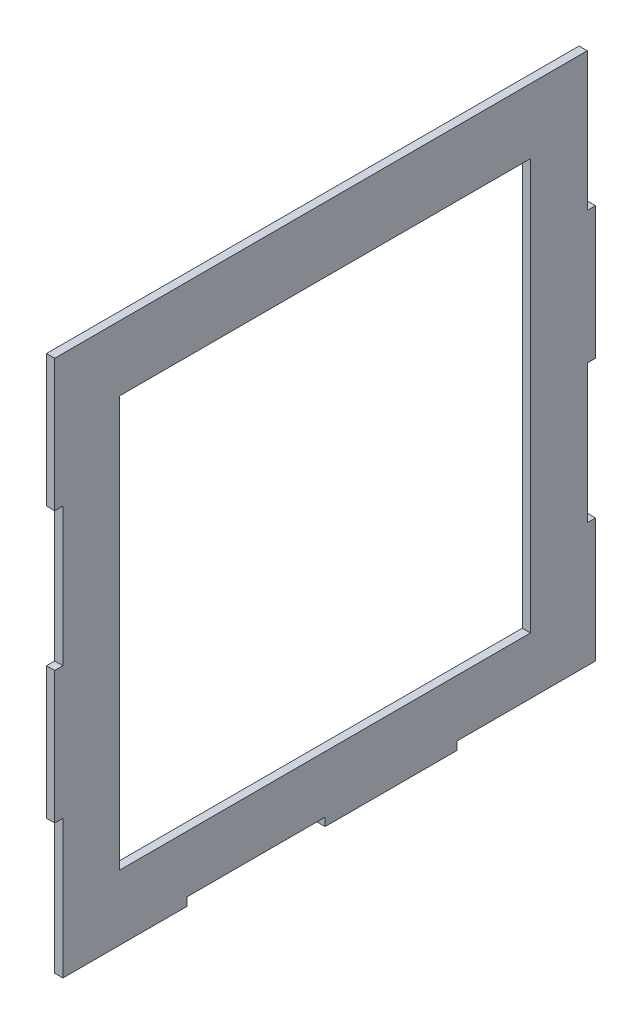
ISO-10303-21;
HEADER;
FILE_DESCRIPTION(('STEP AP214'),'2;1');
FILE_NAME('part.step','',(''),(''),'','','');
FILE_SCHEMA(('AUTOMOTIVE_DESIGN { 1 0 10303 214 1 1 1 1 }'));
ENDSEC;
DATA;
#1=APPLICATION_CONTEXT('core data for automotive mechanical design processes');
#2=APPLICATION_PROTOCOL_DEFINITION('international standard','automotive_design',2000,#1);
#3=PRODUCT_CONTEXT('',#1,'mechanical');
#4=PRODUCT('Part','Part','',(#3));
#5=PRODUCT_RELATED_PRODUCT_CATEGORY('part','',(#4));
#6=PRODUCT_DEFINITION_FORMATION('','',#4);
#7=PRODUCT_DEFINITION_CONTEXT('part definition',#1,'design');
#8=PRODUCT_DEFINITION('design','',#6,#7);
#9=PRODUCT_DEFINITION_SHAPE('','',#8);
#10=(LENGTH_UNIT() NAMED_UNIT(*) SI_UNIT(.MILLI.,.METRE.));
#11=(NAMED_UNIT(*) PLANE_ANGLE_UNIT() SI_UNIT($,.RADIAN.));
#12=(NAMED_UNIT(*) SI_UNIT($,.STERADIAN.) SOLID_ANGLE_UNIT());
#13=UNCERTAINTY_MEASURE_WITH_UNIT(LENGTH_MEASURE(1.E-05),#10,'distance_accuracy_value','');
#14=(GEOMETRIC_REPRESENTATION_CONTEXT(3) GLOBAL_UNCERTAINTY_ASSIGNED_CONTEXT((#13)) GLOBAL_UNIT_ASSIGNED_CONTEXT((#10,
#11,#12)) REPRESENTATION_CONTEXT('',''));
#15=CARTESIAN_POINT('',(0.,0.,0.));
#16=DIRECTION('',(0.,0.,1.));
#17=DIRECTION('',(1.,0.,0.));
#18=AXIS2_PLACEMENT_3D('',#15,#16,#17);
#19=CARTESIAN_POINT('',(6.,0.,-149.999999999999));
#20=DIRECTION('',(0.,0.,1.));
#21=DIRECTION('',(1.,0.,0.));
#22=AXIS2_PLACEMENT_3D('',#19,#20,#21);
#23=PLANE('',#22);
#24=DIRECTION('',(0.,1.,0.));
#25=VECTOR('',#24,1.);
#26=CARTESIAN_POINT('',(0.,0.,-149.999999999999));
#27=LINE('',#26,#25);
#28=CARTESIAN_POINT('',(0.,-150.,-149.999999999999));
#29=VERTEX_POINT('',#28);
#30=CARTESIAN_POINT('',(0.,150.,-149.999999999999));
#31=VERTEX_POINT('',#30);
#32=EDGE_CURVE('E307',#29,#31,#27,.T.);
#33=ORIENTED_EDGE('',*,*,#32,.F.);
#34=DIRECTION('',(-1.,0.,0.));
#35=VECTOR('',#34,1.);
#36=CARTESIAN_POINT('',(6.,-150.,-149.999999999999));
#37=LINE('',#36,#35);
#38=CARTESIAN_POINT('',(6.,-150.,-149.999999999999));
#39=VERTEX_POINT('',#38);
#40=EDGE_CURVE('E11',#39,#29,#37,.T.);
#41=ORIENTED_EDGE('',*,*,#40,.F.);
#42=DIRECTION('',(0.,1.,0.));
#43=VECTOR('',#42,1.);
#44=CARTESIAN_POINT('',(6.,0.,-149.999999999999));
#45=LINE('',#44,#43);
#46=CARTESIAN_POINT('',(6.,150.,-149.999999999999));
#47=VERTEX_POINT('',#46);
#48=EDGE_CURVE('E241',#39,#47,#45,.T.);
#49=ORIENTED_EDGE('',*,*,#48,.T.);
#50=DIRECTION('',(-1.,0.,0.));
#51=VECTOR('',#50,1.);
#52=CARTESIAN_POINT('',(6.,150.,-149.999999999999));
#53=LINE('',#52,#51);
#54=EDGE_CURVE('E149',#47,#31,#53,.T.);
#55=ORIENTED_EDGE('',*,*,#54,.T.);
#56=EDGE_LOOP('',(#33,#41,#49,#55));
#57=FACE_BOUND('',#56,.T.);
#58=ADVANCED_FACE('F41',(#57),#23,.T.);
#59=CARTESIAN_POINT('',(6.,-150.,0.));
#60=DIRECTION('',(0.,1.,0.));
#61=DIRECTION('',(0.,0.,1.));
#62=AXIS2_PLACEMENT_3D('',#59,#60,#61);
#63=PLANE('',#62);
#64=DIRECTION('',(0.,0.,-1.));
#65=VECTOR('',#64,1.);
#66=CARTESIAN_POINT('',(0.,-150.,0.));
#67=LINE('',#66,#65);
#68=CARTESIAN_POINT('',(0.,-150.,150.));
#69=VERTEX_POINT('',#68);
#70=EDGE_CURVE('E231',#69,#29,#67,.T.);
#71=ORIENTED_EDGE('',*,*,#70,.F.);
#72=DIRECTION('',(-1.,0.,0.));
#73=VECTOR('',#72,1.);
#74=CARTESIAN_POINT('',(6.,-150.,150.));
#75=LINE('',#74,#73);
#76=CARTESIAN_POINT('',(6.,-150.,150.));
#77=VERTEX_POINT('',#76);
#78=EDGE_CURVE('E51',#77,#69,#75,.T.);
#79=ORIENTED_EDGE('',*,*,#78,.F.);
#80=DIRECTION('',(0.,0.,-1.));
#81=VECTOR('',#80,1.);
#82=CARTESIAN_POINT('',(6.,-150.,0.));
#83=LINE('',#82,#81);
#84=EDGE_CURVE('E229',#77,#39,#83,.T.);
#85=ORIENTED_EDGE('',*,*,#84,.T.);
#86=ORIENTED_EDGE('',*,*,#40,.T.);
#87=EDGE_LOOP('',(#71,#79,#85,#86));
#88=FACE_BOUND('',#87,.T.);
#89=ADVANCED_FACE('F227',(#88),#63,.T.);
#90=CARTESIAN_POINT('',(6.,0.,150.));
#91=DIRECTION('',(0.,0.,1.));
#92=DIRECTION('',(1.,0.,0.));
#93=AXIS2_PLACEMENT_3D('',#90,#91,#92);
#94=PLANE('',#93);
#95=DIRECTION('',(0.,1.,0.));
#96=VECTOR('',#95,1.);
#97=CARTESIAN_POINT('',(0.,0.,150.));
#98=LINE('',#97,#96);
#99=CARTESIAN_POINT('',(0.,150.,150.));
#100=VERTEX_POINT('',#99);
#101=EDGE_CURVE('E310',#69,#100,#98,.T.);
#102=ORIENTED_EDGE('',*,*,#101,.T.);
#103=DIRECTION('',(-1.,0.,0.));
#104=VECTOR('',#103,1.);
#105=CARTESIAN_POINT('',(6.,150.,150.));
#106=LINE('',#105,#104);
#107=CARTESIAN_POINT('',(6.,150.,150.));
#108=VERTEX_POINT('',#107);
#109=EDGE_CURVE('E234',#108,#100,#106,.T.);
#110=ORIENTED_EDGE('',*,*,#109,.F.);
#111=DIRECTION('',(0.,1.,0.));
#112=VECTOR('',#111,1.);
#113=CARTESIAN_POINT('',(6.,0.,150.));
#114=LINE('',#113,#112);
#115=EDGE_CURVE('E237',#77,#108,#114,.T.);
#116=ORIENTED_EDGE('',*,*,#115,.F.);
#117=ORIENTED_EDGE('',*,*,#78,.T.);
#118=EDGE_LOOP('',(#102,#110,#116,#117));
#119=FACE_BOUND('',#118,.T.);
#120=ADVANCED_FACE('F238',(#119),#94,.F.);
#121=CARTESIAN_POINT('',(6.,0.,-191.5));
#122=DIRECTION('',(0.,0.,-1.));
#123=DIRECTION('',(0.,1.,0.));
#124=AXIS2_PLACEMENT_3D('',#121,#122,#123);
#125=PLANE('',#124);
#126=DIRECTION('',(0.,-1.,0.));
#127=VECTOR('',#126,1.);
#128=CARTESIAN_POINT('',(0.,0.,-191.5));
#129=LINE('',#128,#127);
#130=CARTESIAN_POINT('',(0.,0.,-191.5));
#131=VERTEX_POINT('',#130);
#132=CARTESIAN_POINT('',(0.,-101.,-191.5));
#133=VERTEX_POINT('',#132);
#134=EDGE_CURVE('E249',#131,#133,#129,.T.);
#135=ORIENTED_EDGE('',*,*,#134,.F.);
#136=DIRECTION('',(-1.,0.,0.));
#137=VECTOR('',#136,1.);
#138=CARTESIAN_POINT('',(6.,0.,-191.5));
#139=LINE('',#138,#137);
#140=CARTESIAN_POINT('',(6.,0.,-191.5));
#141=VERTEX_POINT('',#140);
#142=EDGE_CURVE('E45',#141,#131,#139,.T.);
#143=ORIENTED_EDGE('',*,*,#142,.F.);
#144=DIRECTION('',(0.,-1.,0.));
#145=VECTOR('',#144,1.);
#146=CARTESIAN_POINT('',(6.,0.,-191.5));
#147=LINE('',#146,#145);
#148=CARTESIAN_POINT('',(6.,-101.,-191.5));
#149=VERTEX_POINT('',#148);
#150=EDGE_CURVE('E313',#141,#149,#147,.T.);
#151=ORIENTED_EDGE('',*,*,#150,.T.);
#152=DIRECTION('',(-1.,0.,0.));
#153=VECTOR('',#152,1.);
#154=CARTESIAN_POINT('',(6.,-101.,-191.5));
#155=LINE('',#154,#153);
#156=EDGE_CURVE('E248',#149,#133,#155,.T.);
#157=ORIENTED_EDGE('',*,*,#156,.T.);
#158=EDGE_LOOP('',(#135,#143,#151,#157));
#159=FACE_BOUND('',#158,.T.);
#160=ADVANCED_FACE('F43',(#159),#125,.T.);
#161=CARTESIAN_POINT('',(6.,0.,0.));
#162=DIRECTION('',(0.,-1.,0.));
#163=DIRECTION('',(0.,0.,-1.));
#164=AXIS2_PLACEMENT_3D('',#161,#162,#163);
#165=PLANE('',#164);
#166=DIRECTION('',(0.,0.,1.));
#167=VECTOR('',#166,1.);
#168=CARTESIAN_POINT('',(0.,0.,0.));
#169=LINE('',#168,#167);
#170=CARTESIAN_POINT('',(0.,0.,-197.5));
#171=VERTEX_POINT('',#170);
#172=EDGE_CURVE('E252',#171,#131,#169,.T.);
#173=ORIENTED_EDGE('',*,*,#172,.F.);
#174=DIRECTION('',(-1.,0.,0.));
#175=VECTOR('',#174,1.);
#176=CARTESIAN_POINT('',(6.,0.,-197.5));
#177=LINE('',#176,#175);
#178=CARTESIAN_POINT('',(6.,0.,-197.5));
#179=VERTEX_POINT('',#178);
#180=EDGE_CURVE('E358',#179,#171,#177,.T.);
#181=ORIENTED_EDGE('',*,*,#180,.F.);
#182=DIRECTION('',(0.,0.,1.));
#183=VECTOR('',#182,1.);
#184=CARTESIAN_POINT('',(6.,0.,0.));
#185=LINE('',#184,#183);
#186=EDGE_CURVE('E367',#179,#141,#185,.T.);
#187=ORIENTED_EDGE('',*,*,#186,.T.);
#188=ORIENTED_EDGE('',*,*,#142,.T.);
#189=EDGE_LOOP('',(#173,#181,#187,#188));
#190=FACE_BOUND('',#189,.T.);
#191=ADVANCED_FACE('F365',(#190),#165,.T.);
#192=CARTESIAN_POINT('',(6.,0.,-197.5));
#193=DIRECTION('',(0.,0.,1.));
#194=DIRECTION('',(1.,0.,0.));
#195=AXIS2_PLACEMENT_3D('',#192,#193,#194);
#196=PLANE('',#195);
#197=DIRECTION('',(0.,1.,0.));
#198=VECTOR('',#197,1.);
#199=CARTESIAN_POINT('',(0.,0.,-197.5));
#200=LINE('',#199,#198);
#201=CARTESIAN_POINT('',(0.,96.5,-197.5));
#202=VERTEX_POINT('',#201);
#203=EDGE_CURVE('E255',#171,#202,#200,.T.);
#204=ORIENTED_EDGE('',*,*,#203,.T.);
#205=DIRECTION('',(-1.,0.,0.));
#206=VECTOR('',#205,1.);
#207=CARTESIAN_POINT('',(6.,96.5,-197.5));
#208=LINE('',#207,#206);
#209=CARTESIAN_POINT('',(6.,96.5,-197.5));
#210=VERTEX_POINT('',#209);
#211=EDGE_CURVE('E356',#210,#202,#208,.T.);
#212=ORIENTED_EDGE('',*,*,#211,.F.);
#213=DIRECTION('',(0.,1.,0.));
#214=VECTOR('',#213,1.);
#215=CARTESIAN_POINT('',(6.,0.,-197.5));
#216=LINE('',#215,#214);
#217=EDGE_CURVE('E384',#179,#210,#216,.T.);
#218=ORIENTED_EDGE('',*,*,#217,.F.);
#219=ORIENTED_EDGE('',*,*,#180,.T.);
#220=EDGE_LOOP('',(#204,#212,#218,#219));
#221=FACE_BOUND('',#220,.T.);
#222=ADVANCED_FACE('F374',(#221),#196,.F.);
#223=CARTESIAN_POINT('',(6.,96.5000000000005,-2.2320108724235E-13));
#224=DIRECTION('',(0.,-1.,0.));
#225=DIRECTION('',(0.,0.,-1.));
#226=AXIS2_PLACEMENT_3D('',#223,#224,#225);
#227=PLANE('',#226);
#228=DIRECTION('',(0.,0.,1.));
#229=VECTOR('',#228,1.);
#230=CARTESIAN_POINT('',(0.,96.5000000000005,-2.2320108724235E-13));
#231=LINE('',#230,#229);
#232=CARTESIAN_POINT('',(0.,96.5,-191.5));
#233=VERTEX_POINT('',#232);
#234=EDGE_CURVE('E257',#202,#233,#231,.T.);
#235=ORIENTED_EDGE('',*,*,#234,.T.);
#236=DIRECTION('',(-1.,0.,0.));
#237=VECTOR('',#236,1.);
#238=CARTESIAN_POINT('',(6.,96.5,-191.5));
#239=LINE('',#238,#237);
#240=CARTESIAN_POINT('',(6.,96.5,-191.5));
#241=VERTEX_POINT('',#240);
#242=EDGE_CURVE('E354',#241,#233,#239,.T.);
#243=ORIENTED_EDGE('',*,*,#242,.F.);
#244=DIRECTION('',(0.,0.,1.));
#245=VECTOR('',#244,1.);
#246=CARTESIAN_POINT('',(6.,96.5000000000005,-2.2320108724235E-13));
#247=LINE('',#246,#245);
#248=EDGE_CURVE('E379',#210,#241,#247,.T.);
#249=ORIENTED_EDGE('',*,*,#248,.F.);
#250=ORIENTED_EDGE('',*,*,#211,.T.);
#251=EDGE_LOOP('',(#235,#243,#249,#250));
#252=FACE_BOUND('',#251,.T.);
#253=ADVANCED_FACE('F377',(#252),#227,.F.);
#254=CARTESIAN_POINT('',(6.,0.,-191.5));
#255=DIRECTION('',(0.,0.,-1.));
#256=DIRECTION('',(0.,1.,0.));
#257=AXIS2_PLACEMENT_3D('',#254,#255,#256);
#258=PLANE('',#257);
#259=DIRECTION('',(0.,-1.,0.));
#260=VECTOR('',#259,1.);
#261=CARTESIAN_POINT('',(0.,0.,-191.5));
#262=LINE('',#261,#260);
#263=CARTESIAN_POINT('',(0.,197.5,-191.5));
#264=VERTEX_POINT('',#263);
#265=EDGE_CURVE('E261',#264,#233,#262,.T.);
#266=ORIENTED_EDGE('',*,*,#265,.F.);
#267=DIRECTION('',(-1.,0.,0.));
#268=VECTOR('',#267,1.);
#269=CARTESIAN_POINT('',(6.,197.5,-191.5));
#270=LINE('',#269,#268);
#271=CARTESIAN_POINT('',(6.,197.5,-191.5));
#272=VERTEX_POINT('',#271);
#273=EDGE_CURVE('E352',#272,#264,#270,.T.);
#274=ORIENTED_EDGE('',*,*,#273,.F.);
#275=DIRECTION('',(0.,-1.,0.));
#276=VECTOR('',#275,1.);
#277=CARTESIAN_POINT('',(6.,0.,-191.5));
#278=LINE('',#277,#276);
#279=EDGE_CURVE('E383',#272,#241,#278,.T.);
#280=ORIENTED_EDGE('',*,*,#279,.T.);
#281=ORIENTED_EDGE('',*,*,#242,.T.);
#282=EDGE_LOOP('',(#266,#274,#280,#281));
#283=FACE_BOUND('',#282,.T.);
#284=ADVANCED_FACE('F503',(#283),#258,.T.);
#285=CARTESIAN_POINT('',(6.,197.5,0.));
#286=DIRECTION('',(0.,1.,0.));
#287=DIRECTION('',(0.,0.,1.));
#288=AXIS2_PLACEMENT_3D('',#285,#286,#287);
#289=PLANE('',#288);
#290=DIRECTION('',(0.,0.,-1.));
#291=VECTOR('',#290,1.);
#292=CARTESIAN_POINT('',(0.,197.5,0.));
#293=LINE('',#292,#291);
#294=CARTESIAN_POINT('',(0.,197.5,197.5));
#295=VERTEX_POINT('',#294);
#296=EDGE_CURVE('E264',#295,#264,#293,.T.);
#297=ORIENTED_EDGE('',*,*,#296,.F.);
#298=DIRECTION('',(-1.,0.,0.));
#299=VECTOR('',#298,1.);
#300=CARTESIAN_POINT('',(6.,197.5,197.5));
#301=LINE('',#300,#299);
#302=CARTESIAN_POINT('',(6.,197.5,197.5));
#303=VERTEX_POINT('',#302);
#304=EDGE_CURVE('E350',#303,#295,#301,.T.);
#305=ORIENTED_EDGE('',*,*,#304,.F.);
#306=DIRECTION('',(0.,0.,-1.));
#307=VECTOR('',#306,1.);
#308=CARTESIAN_POINT('',(6.,197.5,0.));
#309=LINE('',#308,#307);
#310=EDGE_CURVE('E386',#303,#272,#309,.T.);
#311=ORIENTED_EDGE('',*,*,#310,.T.);
#312=ORIENTED_EDGE('',*,*,#273,.T.);
#313=EDGE_LOOP('',(#297,#305,#311,#312));
#314=FACE_BOUND('',#313,.T.);
#315=ADVANCED_FACE('F500',(#314),#289,.T.);
#316=CARTESIAN_POINT('',(6.,0.,197.5));
#317=DIRECTION('',(0.,0.,1.));
#318=DIRECTION('',(1.,0.,0.));
#319=AXIS2_PLACEMENT_3D('',#316,#317,#318);
#320=PLANE('',#319);
#321=DIRECTION('',(0.,1.,0.));
#322=VECTOR('',#321,1.);
#323=CARTESIAN_POINT('',(0.,0.,197.5));
#324=LINE('',#323,#322);
#325=CARTESIAN_POINT('',(0.,101.,197.5));
#326=VERTEX_POINT('',#325);
#327=EDGE_CURVE('E267',#326,#295,#324,.T.);
#328=ORIENTED_EDGE('',*,*,#327,.F.);
#329=DIRECTION('',(-1.,0.,0.));
#330=VECTOR('',#329,1.);
#331=CARTESIAN_POINT('',(6.,101.,197.5));
#332=LINE('',#331,#330);
#333=CARTESIAN_POINT('',(6.,101.,197.5));
#334=VERTEX_POINT('',#333);
#335=EDGE_CURVE('E348',#334,#326,#332,.T.);
#336=ORIENTED_EDGE('',*,*,#335,.F.);
#337=DIRECTION('',(0.,1.,0.));
#338=VECTOR('',#337,1.);
#339=CARTESIAN_POINT('',(6.,0.,197.5));
#340=LINE('',#339,#338);
#341=EDGE_CURVE('E394',#334,#303,#340,.T.);
#342=ORIENTED_EDGE('',*,*,#341,.T.);
#343=ORIENTED_EDGE('',*,*,#304,.T.);
#344=EDGE_LOOP('',(#328,#336,#342,#343));
#345=FACE_BOUND('',#344,.T.);
#346=ADVANCED_FACE('F496',(#345),#320,.T.);
#347=CARTESIAN_POINT('',(6.,101.,0.));
#348=DIRECTION('',(0.,1.,0.));
#349=DIRECTION('',(0.,0.,1.));
#350=AXIS2_PLACEMENT_3D('',#347,#348,#349);
#351=PLANE('',#350);
#352=DIRECTION('',(0.,0.,-1.));
#353=VECTOR('',#352,1.);
#354=CARTESIAN_POINT('',(0.,101.,0.));
#355=LINE('',#354,#353);
#356=CARTESIAN_POINT('',(0.,101.,191.5));
#357=VERTEX_POINT('',#356);
#358=EDGE_CURVE('E270',#326,#357,#355,.T.);
#359=ORIENTED_EDGE('',*,*,#358,.T.);
#360=DIRECTION('',(-1.,0.,0.));
#361=VECTOR('',#360,1.);
#362=CARTESIAN_POINT('',(6.,101.,191.5));
#363=LINE('',#362,#361);
#364=CARTESIAN_POINT('',(6.,101.,191.5));
#365=VERTEX_POINT('',#364);
#366=EDGE_CURVE('E346',#365,#357,#363,.T.);
#367=ORIENTED_EDGE('',*,*,#366,.F.);
#368=DIRECTION('',(0.,0.,-1.));
#369=VECTOR('',#368,1.);
#370=CARTESIAN_POINT('',(6.,101.,0.));
#371=LINE('',#370,#369);
#372=EDGE_CURVE('E397',#334,#365,#371,.T.);
#373=ORIENTED_EDGE('',*,*,#372,.F.);
#374=ORIENTED_EDGE('',*,*,#335,.T.);
#375=EDGE_LOOP('',(#359,#367,#373,#374));
#376=FACE_BOUND('',#375,.T.);
#377=ADVANCED_FACE('F493',(#376),#351,.F.);
#378=CARTESIAN_POINT('',(6.,0.,191.5));
#379=DIRECTION('',(0.,0.,1.));
#380=DIRECTION('',(1.,0.,0.));
#381=AXIS2_PLACEMENT_3D('',#378,#379,#380);
#382=PLANE('',#381);
#383=DIRECTION('',(0.,1.,0.));
#384=VECTOR('',#383,1.);
#385=CARTESIAN_POINT('',(0.,0.,191.5));
#386=LINE('',#385,#384);
#387=CARTESIAN_POINT('',(0.,0.,191.5));
#388=VERTEX_POINT('',#387);
#389=EDGE_CURVE('E274',#388,#357,#386,.T.);
#390=ORIENTED_EDGE('',*,*,#389,.F.);
#391=DIRECTION('',(-1.,0.,0.));
#392=VECTOR('',#391,1.);
#393=CARTESIAN_POINT('',(6.,0.,191.5));
#394=LINE('',#393,#392);
#395=CARTESIAN_POINT('',(6.,0.,191.5));
#396=VERTEX_POINT('',#395);
#397=EDGE_CURVE('E344',#396,#388,#394,.T.);
#398=ORIENTED_EDGE('',*,*,#397,.F.);
#399=DIRECTION('',(0.,1.,0.));
#400=VECTOR('',#399,1.);
#401=CARTESIAN_POINT('',(6.,0.,191.5));
#402=LINE('',#401,#400);
#403=EDGE_CURVE('E400',#396,#365,#402,.T.);
#404=ORIENTED_EDGE('',*,*,#403,.T.);
#405=ORIENTED_EDGE('',*,*,#366,.T.);
#406=EDGE_LOOP('',(#390,#398,#404,#405));
#407=FACE_BOUND('',#406,.T.);
#408=ADVANCED_FACE('F488',(#407),#382,.T.);
#409=CARTESIAN_POINT('',(6.,0.,0.));
#410=DIRECTION('',(0.,1.,0.));
#411=DIRECTION('',(0.,0.,1.));
#412=AXIS2_PLACEMENT_3D('',#409,#410,#411);
#413=PLANE('',#412);
#414=DIRECTION('',(0.,0.,-1.));
#415=VECTOR('',#414,1.);
#416=CARTESIAN_POINT('',(0.,0.,0.));
#417=LINE('',#416,#415);
#418=CARTESIAN_POINT('',(0.,0.,197.5));
#419=VERTEX_POINT('',#418);
#420=EDGE_CURVE('E277',#419,#388,#417,.T.);
#421=ORIENTED_EDGE('',*,*,#420,.F.);
#422=DIRECTION('',(-1.,0.,0.));
#423=VECTOR('',#422,1.);
#424=CARTESIAN_POINT('',(6.,0.,197.5));
#425=LINE('',#424,#423);
#426=CARTESIAN_POINT('',(6.,0.,197.5));
#427=VERTEX_POINT('',#426);
#428=EDGE_CURVE('E342',#427,#419,#425,.T.);
#429=ORIENTED_EDGE('',*,*,#428,.F.);
#430=DIRECTION('',(0.,0.,-1.));
#431=VECTOR('',#430,1.);
#432=CARTESIAN_POINT('',(6.,0.,0.));
#433=LINE('',#432,#431);
#434=EDGE_CURVE('E403',#427,#396,#433,.T.);
#435=ORIENTED_EDGE('',*,*,#434,.T.);
#436=ORIENTED_EDGE('',*,*,#397,.T.);
#437=EDGE_LOOP('',(#421,#429,#435,#436));
#438=FACE_BOUND('',#437,.T.);
#439=ADVANCED_FACE('F483',(#438),#413,.T.);
#440=CARTESIAN_POINT('',(0.,-96.5,197.5));
#441=VERTEX_POINT('',#440);
#442=EDGE_CURVE('E271',#441,#419,#324,.T.);
#443=ORIENTED_EDGE('',*,*,#442,.F.);
#444=DIRECTION('',(-1.,0.,0.));
#445=VECTOR('',#444,1.);
#446=CARTESIAN_POINT('',(6.,-96.5,197.5));
#447=LINE('',#446,#445);
#448=CARTESIAN_POINT('',(6.,-96.5,197.5));
#449=VERTEX_POINT('',#448);
#450=EDGE_CURVE('E340',#449,#441,#447,.T.);
#451=ORIENTED_EDGE('',*,*,#450,.F.);
#452=EDGE_CURVE('E398',#449,#427,#340,.T.);
#453=ORIENTED_EDGE('',*,*,#452,.T.);
#454=ORIENTED_EDGE('',*,*,#428,.T.);
#455=EDGE_LOOP('',(#443,#451,#453,#454));
#456=FACE_BOUND('',#455,.T.);
#457=ADVANCED_FACE('F476',(#456),#320,.T.);
#458=CARTESIAN_POINT('',(6.,-96.5,0.));
#459=DIRECTION('',(0.,1.,0.));
#460=DIRECTION('',(0.,0.,1.));
#461=AXIS2_PLACEMENT_3D('',#458,#459,#460);
#462=PLANE('',#461);
#463=DIRECTION('',(0.,0.,-1.));
#464=VECTOR('',#463,1.);
#465=CARTESIAN_POINT('',(0.,-96.5,0.));
#466=LINE('',#465,#464);
#467=CARTESIAN_POINT('',(0.,-96.5,191.5));
#468=VERTEX_POINT('',#467);
#469=EDGE_CURVE('E280',#441,#468,#466,.T.);
#470=ORIENTED_EDGE('',*,*,#469,.T.);
#471=DIRECTION('',(-1.,0.,0.));
#472=VECTOR('',#471,1.);
#473=CARTESIAN_POINT('',(6.,-96.5,191.5));
#474=LINE('',#473,#472);
#475=CARTESIAN_POINT('',(6.,-96.5,191.5));
#476=VERTEX_POINT('',#475);
#477=EDGE_CURVE('E338',#476,#468,#474,.T.);
#478=ORIENTED_EDGE('',*,*,#477,.F.);
#479=DIRECTION('',(0.,0.,-1.));
#480=VECTOR('',#479,1.);
#481=CARTESIAN_POINT('',(6.,-96.5,0.));
#482=LINE('',#481,#480);
#483=EDGE_CURVE('E406',#449,#476,#482,.T.);
#484=ORIENTED_EDGE('',*,*,#483,.F.);
#485=ORIENTED_EDGE('',*,*,#450,.T.);
#486=EDGE_LOOP('',(#470,#478,#484,#485));
#487=FACE_BOUND('',#486,.T.);
#488=ADVANCED_FACE('F504',(#487),#462,.F.);
#489=CARTESIAN_POINT('',(6.,0.,191.5));
#490=DIRECTION('',(0.,0.,1.));
#491=DIRECTION('',(1.,0.,0.));
#492=AXIS2_PLACEMENT_3D('',#489,#490,#491);
#493=PLANE('',#492);
#494=DIRECTION('',(0.,1.,0.));
#495=VECTOR('',#494,1.);
#496=CARTESIAN_POINT('',(0.,0.,191.5));
#497=LINE('',#496,#495);
#498=CARTESIAN_POINT('',(0.,-197.5,191.5));
#499=VERTEX_POINT('',#498);
#500=EDGE_CURVE('E283',#499,#468,#497,.T.);
#501=ORIENTED_EDGE('',*,*,#500,.F.);
#502=DIRECTION('',(-1.,0.,0.));
#503=VECTOR('',#502,1.);
#504=CARTESIAN_POINT('',(6.,-197.5,191.5));
#505=LINE('',#504,#503);
#506=CARTESIAN_POINT('',(6.,-197.5,191.5));
#507=VERTEX_POINT('',#506);
#508=EDGE_CURVE('E336',#507,#499,#505,.T.);
#509=ORIENTED_EDGE('',*,*,#508,.F.);
#510=DIRECTION('',(0.,1.,0.));
#511=VECTOR('',#510,1.);
#512=CARTESIAN_POINT('',(6.,0.,191.5));
#513=LINE('',#512,#511);
#514=EDGE_CURVE('E408',#507,#476,#513,.T.);
#515=ORIENTED_EDGE('',*,*,#514,.T.);
#516=ORIENTED_EDGE('',*,*,#477,.T.);
#517=EDGE_LOOP('',(#501,#509,#515,#516));
#518=FACE_BOUND('',#517,.T.);
#519=ADVANCED_FACE('F469',(#518),#493,.T.);
#520=CARTESIAN_POINT('',(6.,-197.5,0.));
#521=DIRECTION('',(0.,1.,0.));
#522=DIRECTION('',(0.,0.,1.));
#523=AXIS2_PLACEMENT_3D('',#520,#521,#522);
#524=PLANE('',#523);
#525=DIRECTION('',(0.,0.,-1.));
#526=VECTOR('',#525,1.);
#527=CARTESIAN_POINT('',(0.,-197.5,0.));
#528=LINE('',#527,#526);
#529=CARTESIAN_POINT('',(0.,-197.5,101.));
#530=VERTEX_POINT('',#529);
#531=EDGE_CURVE('E286',#499,#530,#528,.T.);
#532=ORIENTED_EDGE('',*,*,#531,.T.);
#533=DIRECTION('',(-1.,0.,0.));
#534=VECTOR('',#533,1.);
#535=CARTESIAN_POINT('',(6.,-197.5,101.));
#536=LINE('',#535,#534);
#537=CARTESIAN_POINT('',(6.,-197.5,101.));
#538=VERTEX_POINT('',#537);
#539=EDGE_CURVE('E333',#538,#530,#536,.T.);
#540=ORIENTED_EDGE('',*,*,#539,.F.);
#541=DIRECTION('',(0.,0.,-1.));
#542=VECTOR('',#541,1.);
#543=CARTESIAN_POINT('',(6.,-197.5,0.));
#544=LINE('',#543,#542);
#545=EDGE_CURVE('E411',#507,#538,#544,.T.);
#546=ORIENTED_EDGE('',*,*,#545,.F.);
#547=ORIENTED_EDGE('',*,*,#508,.T.);
#548=EDGE_LOOP('',(#532,#540,#546,#547));
#549=FACE_BOUND('',#548,.T.);
#550=ADVANCED_FACE('F466',(#549),#524,.F.);
#551=CARTESIAN_POINT('',(6.,2.3360942809821E-13,101.));
#552=DIRECTION('',(0.,0.,1.));
#553=DIRECTION('',(0.,-1.,0.));
#554=AXIS2_PLACEMENT_3D('',#551,#552,#553);
#555=PLANE('',#554);
#556=DIRECTION('',(0.,1.,0.));
#557=VECTOR('',#556,1.);
#558=CARTESIAN_POINT('',(0.,2.3360942809821E-13,101.));
#559=LINE('',#558,#557);
#560=CARTESIAN_POINT('',(0.,-191.5,101.));
#561=VERTEX_POINT('',#560);
#562=EDGE_CURVE('E288',#530,#561,#559,.T.);
#563=ORIENTED_EDGE('',*,*,#562,.T.);
#564=DIRECTION('',(-1.,0.,0.));
#565=VECTOR('',#564,1.);
#566=CARTESIAN_POINT('',(6.,-191.5,101.));
#567=LINE('',#566,#565);
#568=CARTESIAN_POINT('',(6.,-191.5,101.));
#569=VERTEX_POINT('',#568);
#570=EDGE_CURVE('E331',#569,#561,#567,.T.);
#571=ORIENTED_EDGE('',*,*,#570,.F.);
#572=DIRECTION('',(0.,1.,0.));
#573=VECTOR('',#572,1.);
#574=CARTESIAN_POINT('',(6.,2.3360942809821E-13,101.));
#575=LINE('',#574,#573);
#576=EDGE_CURVE('E413',#538,#569,#575,.T.);
#577=ORIENTED_EDGE('',*,*,#576,.F.);
#578=ORIENTED_EDGE('',*,*,#539,.T.);
#579=EDGE_LOOP('',(#563,#571,#577,#578));
#580=FACE_BOUND('',#579,.T.);
#581=ADVANCED_FACE('F461',(#580),#555,.F.);
#582=CARTESIAN_POINT('',(6.,-191.5,0.));
#583=DIRECTION('',(0.,-1.,0.));
#584=DIRECTION('',(0.,0.,-1.));
#585=AXIS2_PLACEMENT_3D('',#582,#583,#584);
#586=PLANE('',#585);
#587=DIRECTION('',(0.,0.,1.));
#588=VECTOR('',#587,1.);
#589=CARTESIAN_POINT('',(0.,-191.5,0.));
#590=LINE('',#589,#588);
#591=CARTESIAN_POINT('',(0.,-191.5,0.));
#592=VERTEX_POINT('',#591);
#593=EDGE_CURVE('E292',#592,#561,#590,.T.);
#594=ORIENTED_EDGE('',*,*,#593,.F.);
#595=DIRECTION('',(-1.,0.,0.));
#596=VECTOR('',#595,1.);
#597=CARTESIAN_POINT('',(6.,-191.5,0.));
#598=LINE('',#597,#596);
#599=CARTESIAN_POINT('',(6.,-191.5,0.));
#600=VERTEX_POINT('',#599);
#601=EDGE_CURVE('E329',#600,#592,#598,.T.);
#602=ORIENTED_EDGE('',*,*,#601,.F.);
#603=DIRECTION('',(0.,0.,1.));
#604=VECTOR('',#603,1.);
#605=CARTESIAN_POINT('',(6.,-191.5,0.));
#606=LINE('',#605,#604);
#607=EDGE_CURVE('E416',#600,#569,#606,.T.);
#608=ORIENTED_EDGE('',*,*,#607,.T.);
#609=ORIENTED_EDGE('',*,*,#570,.T.);
#610=EDGE_LOOP('',(#594,#602,#608,#609));
#611=FACE_BOUND('',#610,.T.);
#612=ADVANCED_FACE('F455',(#611),#586,.T.);
#613=CARTESIAN_POINT('',(6.,0.,0.));
#614=DIRECTION('',(0.,0.,1.));
#615=DIRECTION('',(0.,-1.,0.));
#616=AXIS2_PLACEMENT_3D('',#613,#614,#615);
#617=PLANE('',#616);
#618=DIRECTION('',(0.,1.,0.));
#619=VECTOR('',#618,1.);
#620=CARTESIAN_POINT('',(0.,0.,0.));
#621=LINE('',#620,#619);
#622=CARTESIAN_POINT('',(0.,-197.5,0.));
#623=VERTEX_POINT('',#622);
#624=EDGE_CURVE('E295',#623,#592,#621,.T.);
#625=ORIENTED_EDGE('',*,*,#624,.F.);
#626=DIRECTION('',(-1.,0.,0.));
#627=VECTOR('',#626,1.);
#628=CARTESIAN_POINT('',(6.,-197.5,0.));
#629=LINE('',#628,#627);
#630=CARTESIAN_POINT('',(6.,-197.5,0.));
#631=VERTEX_POINT('',#630);
#632=EDGE_CURVE('E327',#631,#623,#629,.T.);
#633=ORIENTED_EDGE('',*,*,#632,.F.);
#634=DIRECTION('',(0.,1.,0.));
#635=VECTOR('',#634,1.);
#636=CARTESIAN_POINT('',(6.,0.,0.));
#637=LINE('',#636,#635);
#638=EDGE_CURVE('E419',#631,#600,#637,.T.);
#639=ORIENTED_EDGE('',*,*,#638,.T.);
#640=ORIENTED_EDGE('',*,*,#601,.T.);
#641=EDGE_LOOP('',(#625,#633,#639,#640));
#642=FACE_BOUND('',#641,.T.);
#643=ADVANCED_FACE('F449',(#642),#617,.T.);
#644=CARTESIAN_POINT('',(0.,-197.5,-96.5));
#645=VERTEX_POINT('',#644);
#646=EDGE_CURVE('E289',#623,#645,#528,.T.);
#647=ORIENTED_EDGE('',*,*,#646,.T.);
#648=DIRECTION('',(-1.,0.,0.));
#649=VECTOR('',#648,1.);
#650=CARTESIAN_POINT('',(6.,-197.5,-96.5));
#651=LINE('',#650,#649);
#652=CARTESIAN_POINT('',(6.,-197.5,-96.5));
#653=VERTEX_POINT('',#652);
#654=EDGE_CURVE('E324',#653,#645,#651,.T.);
#655=ORIENTED_EDGE('',*,*,#654,.F.);
#656=EDGE_CURVE('E414',#631,#653,#544,.T.);
#657=ORIENTED_EDGE('',*,*,#656,.F.);
#658=ORIENTED_EDGE('',*,*,#632,.T.);
#659=EDGE_LOOP('',(#647,#655,#657,#658));
#660=FACE_BOUND('',#659,.T.);
#661=ADVANCED_FACE('F530',(#660),#524,.F.);
#662=CARTESIAN_POINT('',(6.,2.23201087242348E-13,-96.4999999999995));
#663=DIRECTION('',(0.,0.,1.));
#664=DIRECTION('',(0.,-1.,0.));
#665=AXIS2_PLACEMENT_3D('',#662,#663,#664);
#666=PLANE('',#665);
#667=DIRECTION('',(0.,1.,0.));
#668=VECTOR('',#667,1.);
#669=CARTESIAN_POINT('',(0.,2.23201087242348E-13,-96.4999999999995));
#670=LINE('',#669,#668);
#671=CARTESIAN_POINT('',(0.,-191.5,-96.5));
#672=VERTEX_POINT('',#671);
#673=EDGE_CURVE('E298',#645,#672,#670,.T.);
#674=ORIENTED_EDGE('',*,*,#673,.T.);
#675=DIRECTION('',(-1.,0.,0.));
#676=VECTOR('',#675,1.);
#677=CARTESIAN_POINT('',(6.,-191.5,-96.5));
#678=LINE('',#677,#676);
#679=CARTESIAN_POINT('',(6.,-191.5,-96.5));
#680=VERTEX_POINT('',#679);
#681=EDGE_CURVE('E322',#680,#672,#678,.T.);
#682=ORIENTED_EDGE('',*,*,#681,.F.);
#683=DIRECTION('',(0.,1.,0.));
#684=VECTOR('',#683,1.);
#685=CARTESIAN_POINT('',(6.,2.23201087242348E-13,-96.4999999999995));
#686=LINE('',#685,#684);
#687=EDGE_CURVE('E422',#653,#680,#686,.T.);
#688=ORIENTED_EDGE('',*,*,#687,.F.);
#689=ORIENTED_EDGE('',*,*,#654,.T.);
#690=EDGE_LOOP('',(#674,#682,#688,#689));
#691=FACE_BOUND('',#690,.T.);
#692=ADVANCED_FACE('F443',(#691),#666,.F.);
#693=CARTESIAN_POINT('',(6.,-191.5,0.));
#694=DIRECTION('',(0.,-1.,0.));
#695=DIRECTION('',(0.,0.,-1.));
#696=AXIS2_PLACEMENT_3D('',#693,#694,#695);
#697=PLANE('',#696);
#698=DIRECTION('',(0.,0.,1.));
#699=VECTOR('',#698,1.);
#700=CARTESIAN_POINT('',(0.,-191.5,0.));
#701=LINE('',#700,#699);
#702=CARTESIAN_POINT('',(0.,-191.5,-197.5));
#703=VERTEX_POINT('',#702);
#704=EDGE_CURVE('E301',#703,#672,#701,.T.);
#705=ORIENTED_EDGE('',*,*,#704,.F.);
#706=DIRECTION('',(-1.,0.,0.));
#707=VECTOR('',#706,1.);
#708=CARTESIAN_POINT('',(6.,-191.5,-197.5));
#709=LINE('',#708,#707);
#710=CARTESIAN_POINT('',(6.,-191.5,-197.5));
#711=VERTEX_POINT('',#710);
#712=EDGE_CURVE('E320',#711,#703,#709,.T.);
#713=ORIENTED_EDGE('',*,*,#712,.F.);
#714=DIRECTION('',(0.,0.,1.));
#715=VECTOR('',#714,1.);
#716=CARTESIAN_POINT('',(6.,-191.5,0.));
#717=LINE('',#716,#715);
#718=EDGE_CURVE('E424',#711,#680,#717,.T.);
#719=ORIENTED_EDGE('',*,*,#718,.T.);
#720=ORIENTED_EDGE('',*,*,#681,.T.);
#721=EDGE_LOOP('',(#705,#713,#719,#720));
#722=FACE_BOUND('',#721,.T.);
#723=ADVANCED_FACE('F439',(#722),#697,.T.);
#724=CARTESIAN_POINT('',(0.,-101.,-197.5));
#725=VERTEX_POINT('',#724);
#726=EDGE_CURVE('E258',#703,#725,#200,.T.);
#727=ORIENTED_EDGE('',*,*,#726,.T.);
#728=DIRECTION('',(-1.,0.,0.));
#729=VECTOR('',#728,1.);
#730=CARTESIAN_POINT('',(6.,-101.,-197.5));
#731=LINE('',#730,#729);
#732=CARTESIAN_POINT('',(6.,-101.,-197.5));
#733=VERTEX_POINT('',#732);
#734=EDGE_CURVE('E317',#733,#725,#731,.T.);
#735=ORIENTED_EDGE('',*,*,#734,.F.);
#736=EDGE_CURVE('E389',#711,#733,#216,.T.);
#737=ORIENTED_EDGE('',*,*,#736,.F.);
#738=ORIENTED_EDGE('',*,*,#712,.T.);
#739=EDGE_LOOP('',(#727,#735,#737,#738));
#740=FACE_BOUND('',#739,.T.);
#741=ADVANCED_FACE('F431',(#740),#196,.F.);
#742=CARTESIAN_POINT('',(6.,-101.,0.));
#743=DIRECTION('',(0.,-1.,0.));
#744=DIRECTION('',(0.,0.,-1.));
#745=AXIS2_PLACEMENT_3D('',#742,#743,#744);
#746=PLANE('',#745);
#747=DIRECTION('',(0.,0.,1.));
#748=VECTOR('',#747,1.);
#749=CARTESIAN_POINT('',(0.,-101.,0.));
#750=LINE('',#749,#748);
#751=EDGE_CURVE('E304',#725,#133,#750,.T.);
#752=ORIENTED_EDGE('',*,*,#751,.T.);
#753=ORIENTED_EDGE('',*,*,#156,.F.);
#754=DIRECTION('',(0.,0.,1.));
#755=VECTOR('',#754,1.);
#756=CARTESIAN_POINT('',(6.,-101.,0.));
#757=LINE('',#756,#755);
#758=EDGE_CURVE('E243',#733,#149,#757,.T.);
#759=ORIENTED_EDGE('',*,*,#758,.F.);
#760=ORIENTED_EDGE('',*,*,#734,.T.);
#761=EDGE_LOOP('',(#752,#753,#759,#760));
#762=FACE_BOUND('',#761,.T.);
#763=ADVANCED_FACE('F434',(#762),#746,.F.);
#764=CARTESIAN_POINT('',(6.,150.,0.));
#765=DIRECTION('',(0.,1.,0.));
#766=DIRECTION('',(0.,0.,1.));
#767=AXIS2_PLACEMENT_3D('',#764,#765,#766);
#768=PLANE('',#767);
#769=DIRECTION('',(0.,0.,-1.));
#770=VECTOR('',#769,1.);
#771=CARTESIAN_POINT('',(0.,150.,0.));
#772=LINE('',#771,#770);
#773=EDGE_CURVE('E142',#100,#31,#772,.T.);
#774=ORIENTED_EDGE('',*,*,#773,.T.);
#775=ORIENTED_EDGE('',*,*,#54,.F.);
#776=DIRECTION('',(0.,0.,-1.));
#777=VECTOR('',#776,1.);
#778=CARTESIAN_POINT('',(6.,150.,0.));
#779=LINE('',#778,#777);
#780=EDGE_CURVE('E60',#108,#47,#779,.T.);
#781=ORIENTED_EDGE('',*,*,#780,.F.);
#782=ORIENTED_EDGE('',*,*,#109,.T.);
#783=EDGE_LOOP('',(#774,#775,#781,#782));
#784=FACE_BOUND('',#783,.T.);
#785=ADVANCED_FACE('F523',(#784),#768,.F.);
#786=CARTESIAN_POINT('',(6.,0.,0.));
#787=DIRECTION('',(1.,0.,0.));
#788=DIRECTION('',(0.,0.,-1.));
#789=AXIS2_PLACEMENT_3D('',#786,#787,#788);
#790=PLANE('',#789);
#791=ORIENTED_EDGE('',*,*,#150,.F.);
#792=ORIENTED_EDGE('',*,*,#186,.F.);
#793=ORIENTED_EDGE('',*,*,#217,.T.);
#794=ORIENTED_EDGE('',*,*,#248,.T.);
#795=ORIENTED_EDGE('',*,*,#279,.F.);
#796=ORIENTED_EDGE('',*,*,#310,.F.);
#797=ORIENTED_EDGE('',*,*,#341,.F.);
#798=ORIENTED_EDGE('',*,*,#372,.T.);
#799=ORIENTED_EDGE('',*,*,#403,.F.);
#800=ORIENTED_EDGE('',*,*,#434,.F.);
#801=ORIENTED_EDGE('',*,*,#452,.F.);
#802=ORIENTED_EDGE('',*,*,#483,.T.);
#803=ORIENTED_EDGE('',*,*,#514,.F.);
#804=ORIENTED_EDGE('',*,*,#545,.T.);
#805=ORIENTED_EDGE('',*,*,#576,.T.);
#806=ORIENTED_EDGE('',*,*,#607,.F.);
#807=ORIENTED_EDGE('',*,*,#638,.F.);
#808=ORIENTED_EDGE('',*,*,#656,.T.);
#809=ORIENTED_EDGE('',*,*,#687,.T.);
#810=ORIENTED_EDGE('',*,*,#718,.F.);
#811=ORIENTED_EDGE('',*,*,#736,.T.);
#812=ORIENTED_EDGE('',*,*,#758,.T.);
#813=EDGE_LOOP('',(#791,#792,#793,#794,#795,#796,#797,#798,#799,#800,#801,#802,#803,#804,#805,
#806,#807,#808,#809,#810,#811,#812));
#814=FACE_BOUND('',#813,.T.);
#815=ORIENTED_EDGE('',*,*,#48,.F.);
#816=ORIENTED_EDGE('',*,*,#84,.F.);
#817=ORIENTED_EDGE('',*,*,#115,.T.);
#818=ORIENTED_EDGE('',*,*,#780,.T.);
#819=EDGE_LOOP('',(#815,#816,#817,#818));
#820=FACE_BOUND('',#819,.T.);
#821=ADVANCED_FACE('F240',(#814,#820),#790,.T.);
#822=CARTESIAN_POINT('',(0.,0.,0.));
#823=DIRECTION('',(1.,0.,0.));
#824=DIRECTION('',(0.,0.,-1.));
#825=AXIS2_PLACEMENT_3D('',#822,#823,#824);
#826=PLANE('',#825);
#827=ORIENTED_EDGE('',*,*,#134,.T.);
#828=ORIENTED_EDGE('',*,*,#751,.F.);
#829=ORIENTED_EDGE('',*,*,#726,.F.);
#830=ORIENTED_EDGE('',*,*,#704,.T.);
#831=ORIENTED_EDGE('',*,*,#673,.F.);
#832=ORIENTED_EDGE('',*,*,#646,.F.);
#833=ORIENTED_EDGE('',*,*,#624,.T.);
#834=ORIENTED_EDGE('',*,*,#593,.T.);
#835=ORIENTED_EDGE('',*,*,#562,.F.);
#836=ORIENTED_EDGE('',*,*,#531,.F.);
#837=ORIENTED_EDGE('',*,*,#500,.T.);
#838=ORIENTED_EDGE('',*,*,#469,.F.);
#839=ORIENTED_EDGE('',*,*,#442,.T.);
#840=ORIENTED_EDGE('',*,*,#420,.T.);
#841=ORIENTED_EDGE('',*,*,#389,.T.);
#842=ORIENTED_EDGE('',*,*,#358,.F.);
#843=ORIENTED_EDGE('',*,*,#327,.T.);
#844=ORIENTED_EDGE('',*,*,#296,.T.);
#845=ORIENTED_EDGE('',*,*,#265,.T.);
#846=ORIENTED_EDGE('',*,*,#234,.F.);
#847=ORIENTED_EDGE('',*,*,#203,.F.);
#848=ORIENTED_EDGE('',*,*,#172,.T.);
#849=EDGE_LOOP('',(#827,#828,#829,#830,#831,#832,#833,#834,#835,#836,#837,#838,#839,#840,#841,
#842,#843,#844,#845,#846,#847,#848));
#850=FACE_BOUND('',#849,.T.);
#851=ORIENTED_EDGE('',*,*,#32,.T.);
#852=ORIENTED_EDGE('',*,*,#773,.F.);
#853=ORIENTED_EDGE('',*,*,#101,.F.);
#854=ORIENTED_EDGE('',*,*,#70,.T.);
#855=EDGE_LOOP('',(#851,#852,#853,#854));
#856=FACE_BOUND('',#855,.T.);
#857=ADVANCED_FACE('F371',(#850,#856),#826,.F.);
#858=CLOSED_SHELL('',(#58,#89,#120,#160,#191,#222,#253,#284,#315,#346,#377,#408,#439,#457,#488,
#519,#550,#581,#612,#643,#661,#692,#723,#741,#763,#785,#821,#857));
#859=MANIFOLD_SOLID_BREP('B2',#858);
#860=ADVANCED_BREP_SHAPE_REPRESENTATION('',(#18,#859),#14);
#861=SHAPE_DEFINITION_REPRESENTATION(#9,#860);
ENDSEC;
END-ISO-10303-21;
